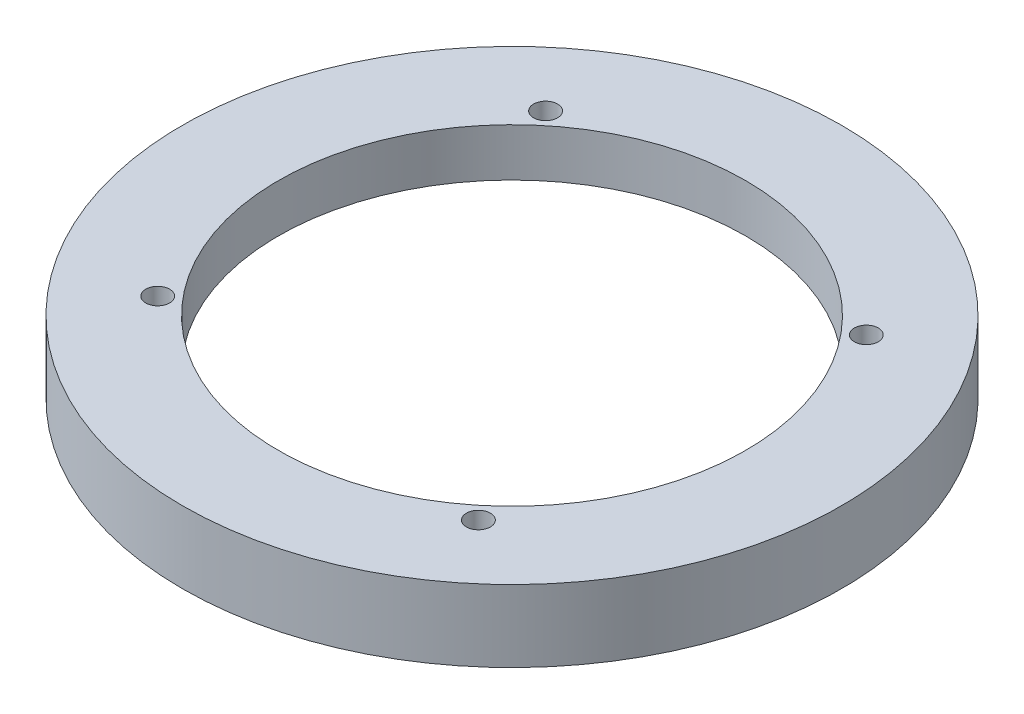
ISO-10303-21;
HEADER;
FILE_DESCRIPTION(('STEP AP214'),'2;1');
FILE_NAME('part.step','',(''),(''),'','','');
FILE_SCHEMA(('AUTOMOTIVE_DESIGN { 1 0 10303 214 1 1 1 1 }'));
ENDSEC;
DATA;
#1=APPLICATION_CONTEXT('core data for automotive mechanical design processes');
#2=APPLICATION_PROTOCOL_DEFINITION('international standard','automotive_design',2000,#1);
#3=PRODUCT_CONTEXT('',#1,'mechanical');
#4=PRODUCT('Part','Part','',(#3));
#5=PRODUCT_RELATED_PRODUCT_CATEGORY('part','',(#4));
#6=PRODUCT_DEFINITION_FORMATION('','',#4);
#7=PRODUCT_DEFINITION_CONTEXT('part definition',#1,'design');
#8=PRODUCT_DEFINITION('design','',#6,#7);
#9=PRODUCT_DEFINITION_SHAPE('','',#8);
#10=(LENGTH_UNIT() NAMED_UNIT(*) SI_UNIT(.MILLI.,.METRE.));
#11=(NAMED_UNIT(*) PLANE_ANGLE_UNIT() SI_UNIT($,.RADIAN.));
#12=(NAMED_UNIT(*) SI_UNIT($,.STERADIAN.) SOLID_ANGLE_UNIT());
#13=UNCERTAINTY_MEASURE_WITH_UNIT(LENGTH_MEASURE(1.E-05),#10,'distance_accuracy_value','');
#14=(GEOMETRIC_REPRESENTATION_CONTEXT(3) GLOBAL_UNCERTAINTY_ASSIGNED_CONTEXT((#13)) GLOBAL_UNIT_ASSIGNED_CONTEXT((#10,
#11,#12)) REPRESENTATION_CONTEXT('',''));
#15=CARTESIAN_POINT('',(0.,0.,0.));
#16=DIRECTION('',(0.,0.,1.));
#17=DIRECTION('',(1.,0.,0.));
#18=AXIS2_PLACEMENT_3D('',#15,#16,#17);
#19=CARTESIAN_POINT('',(0.,0.,0.));
#20=DIRECTION('',(0.,1.,0.));
#21=DIRECTION('',(0.,0.,1.));
#22=AXIS2_PLACEMENT_3D('',#19,#20,#21);
#23=PLANE('',#22);
#24=CARTESIAN_POINT('',(0.,0.,0.));
#25=DIRECTION('',(0.,1.,0.));
#26=DIRECTION('',(0.,0.,1.));
#27=AXIS2_PLACEMENT_3D('',#24,#25,#26);
#28=CIRCLE('',#27,137.5);
#29=CARTESIAN_POINT('',(0.,0.,137.5));
#30=VERTEX_POINT('',#29);
#31=EDGE_CURVE('E10',#30,#30,#28,.T.);
#32=ORIENTED_EDGE('',*,*,#31,.F.);
#33=EDGE_LOOP('',(#32));
#34=FACE_BOUND('',#33,.T.);
#35=CARTESIAN_POINT('',(0.,0.,0.));
#36=DIRECTION('',(0.,1.,0.));
#37=DIRECTION('',(0.,0.,1.));
#38=AXIS2_PLACEMENT_3D('',#35,#36,#37);
#39=CIRCLE('',#38,117.5);
#40=CARTESIAN_POINT('',(0.,0.,117.5));
#41=VERTEX_POINT('',#40);
#42=EDGE_CURVE('E45',#41,#41,#39,.T.);
#43=ORIENTED_EDGE('',*,*,#42,.T.);
#44=EDGE_LOOP('',(#43));
#45=FACE_BOUND('',#44,.T.);
#46=ADVANCED_FACE('F36',(#34,#45),#23,.F.);
#47=CARTESIAN_POINT('',(0.,10.,0.));
#48=DIRECTION('',(0.,-1.,0.));
#49=DIRECTION('',(0.,0.,-1.));
#50=AXIS2_PLACEMENT_3D('',#47,#48,#49);
#51=CYLINDRICAL_SURFACE('',#50,137.5);
#52=ORIENTED_EDGE('',*,*,#31,.T.);
#53=EDGE_LOOP('',(#52));
#54=FACE_BOUND('',#53,.T.);
#55=CARTESIAN_POINT('',(0.,30.,0.));
#56=DIRECTION('',(0.,1.,0.));
#57=DIRECTION('',(0.,0.,1.));
#58=AXIS2_PLACEMENT_3D('',#55,#56,#57);
#59=CIRCLE('',#58,137.5);
#60=CARTESIAN_POINT('',(0.,30.,137.5));
#61=VERTEX_POINT('',#60);
#62=EDGE_CURVE('E89',#61,#61,#59,.T.);
#63=ORIENTED_EDGE('',*,*,#62,.F.);
#64=EDGE_LOOP('',(#63));
#65=FACE_BOUND('',#64,.T.);
#66=ADVANCED_FACE('F38',(#54,#65),#51,.T.);
#67=CARTESIAN_POINT('',(0.,10.,0.));
#68=DIRECTION('',(0.,-1.,0.));
#69=DIRECTION('',(0.,0.,-1.));
#70=AXIS2_PLACEMENT_3D('',#67,#68,#69);
#71=CYLINDRICAL_SURFACE('',#70,117.5);
#72=CARTESIAN_POINT('',(0.,10.,0.));
#73=DIRECTION('',(0.,1.,0.));
#74=DIRECTION('',(0.,0.,1.));
#75=AXIS2_PLACEMENT_3D('',#72,#73,#74);
#76=CIRCLE('',#75,117.5);
#77=CARTESIAN_POINT('',(0.,10.,117.5));
#78=VERTEX_POINT('',#77);
#79=EDGE_CURVE('E51',#78,#78,#76,.T.);
#80=ORIENTED_EDGE('',*,*,#79,.T.);
#81=EDGE_LOOP('',(#80));
#82=FACE_BOUND('',#81,.T.);
#83=ORIENTED_EDGE('',*,*,#42,.F.);
#84=EDGE_LOOP('',(#83));
#85=FACE_BOUND('',#84,.T.);
#86=ADVANCED_FACE('F99',(#82,#85),#71,.F.);
#87=CARTESIAN_POINT('',(0.,10.,0.));
#88=DIRECTION('',(0.,1.,0.));
#89=DIRECTION('',(0.,0.,1.));
#90=AXIS2_PLACEMENT_3D('',#87,#88,#89);
#91=PLANE('',#90);
#92=CARTESIAN_POINT('',(80.9224468627568,10.,-66.9070817920863));
#93=DIRECTION('',(0.,1.,0.));
#94=DIRECTION('',(0.,0.,1.));
#95=AXIS2_PLACEMENT_3D('',#92,#93,#94);
#96=CIRCLE('',#95,5.00000000000001);
#97=CARTESIAN_POINT('',(80.9224468627568,10.,-61.9070817920863));
#98=VERTEX_POINT('',#97);
#99=EDGE_CURVE('E80',#98,#98,#96,.T.);
#100=ORIENTED_EDGE('',*,*,#99,.T.);
#101=EDGE_LOOP('',(#100));
#102=FACE_BOUND('',#101,.T.);
#103=CARTESIAN_POINT('',(66.9070817930606,10.,80.9224468615739));
#104=DIRECTION('',(0.,1.,0.));
#105=DIRECTION('',(0.,0.,1.));
#106=AXIS2_PLACEMENT_3D('',#103,#104,#105);
#107=CIRCLE('',#106,4.99999999999999);
#108=CARTESIAN_POINT('',(66.9070817930606,10.,85.9224468615739));
#109=VERTEX_POINT('',#108);
#110=EDGE_CURVE('E67',#109,#109,#107,.T.);
#111=ORIENTED_EDGE('',*,*,#110,.T.);
#112=EDGE_LOOP('',(#111));
#113=FACE_BOUND('',#112,.T.);
#114=CARTESIAN_POINT('',(-80.9224468605993,10.,66.9070817918775));
#115=DIRECTION('',(0.,1.,0.));
#116=DIRECTION('',(0.,0.,1.));
#117=AXIS2_PLACEMENT_3D('',#114,#115,#116);
#118=CIRCLE('',#117,5.00000000000001);
#119=CARTESIAN_POINT('',(-80.9224468605993,10.,71.9070817918775));
#120=VERTEX_POINT('',#119);
#121=EDGE_CURVE('E63',#120,#120,#118,.T.);
#122=ORIENTED_EDGE('',*,*,#121,.T.);
#123=EDGE_LOOP('',(#122));
#124=FACE_BOUND('',#123,.T.);
#125=CARTESIAN_POINT('',(-66.9070817909032,10.,-80.9224468617801));
#126=DIRECTION('',(0.,1.,0.));
#127=DIRECTION('',(0.,0.,1.));
#128=AXIS2_PLACEMENT_3D('',#125,#126,#127);
#129=CIRCLE('',#128,5.00000000000001);
#130=CARTESIAN_POINT('',(-66.9070817909032,10.,-75.9224468617801));
#131=VERTEX_POINT('',#130);
#132=EDGE_CURVE('E59',#131,#131,#129,.T.);
#133=ORIENTED_EDGE('',*,*,#132,.T.);
#134=EDGE_LOOP('',(#133));
#135=FACE_BOUND('',#134,.T.);
#136=CARTESIAN_POINT('',(0.,10.,0.));
#137=DIRECTION('',(0.,-1.,0.));
#138=DIRECTION('',(0.,0.,-1.));
#139=AXIS2_PLACEMENT_3D('',#136,#137,#138);
#140=CIRCLE('',#139,97.5);
#141=CARTESIAN_POINT('',(0.,10.,-97.5));
#142=VERTEX_POINT('',#141);
#143=EDGE_CURVE('E84',#142,#142,#140,.T.);
#144=ORIENTED_EDGE('',*,*,#143,.F.);
#145=EDGE_LOOP('',(#144));
#146=FACE_BOUND('',#145,.T.);
#147=ORIENTED_EDGE('',*,*,#79,.F.);
#148=EDGE_LOOP('',(#147));
#149=FACE_BOUND('',#148,.T.);
#150=ADVANCED_FACE('F102',(#102,#113,#124,#135,#146,#149),#91,.F.);
#151=CARTESIAN_POINT('',(0.,30.,0.));
#152=DIRECTION('',(0.,1.,0.));
#153=DIRECTION('',(0.,0.,1.));
#154=AXIS2_PLACEMENT_3D('',#151,#152,#153);
#155=PLANE('',#154);
#156=CARTESIAN_POINT('',(80.9224468627568,30.,-66.9070817920863));
#157=DIRECTION('',(0.,1.,0.));
#158=DIRECTION('',(0.,0.,1.));
#159=AXIS2_PLACEMENT_3D('',#156,#157,#158);
#160=CIRCLE('',#159,5.00000000000001);
#161=CARTESIAN_POINT('',(80.9224468627568,30.,-61.9070817920863));
#162=VERTEX_POINT('',#161);
#163=EDGE_CURVE('E40',#162,#162,#160,.T.);
#164=ORIENTED_EDGE('',*,*,#163,.F.);
#165=EDGE_LOOP('',(#164));
#166=FACE_BOUND('',#165,.T.);
#167=CARTESIAN_POINT('',(66.9070817930606,30.,80.9224468615739));
#168=DIRECTION('',(0.,1.,0.));
#169=DIRECTION('',(0.,0.,1.));
#170=AXIS2_PLACEMENT_3D('',#167,#168,#169);
#171=CIRCLE('',#170,4.99999999999999);
#172=CARTESIAN_POINT('',(66.9070817930606,30.,85.9224468615739));
#173=VERTEX_POINT('',#172);
#174=EDGE_CURVE('E64',#173,#173,#171,.T.);
#175=ORIENTED_EDGE('',*,*,#174,.F.);
#176=EDGE_LOOP('',(#175));
#177=FACE_BOUND('',#176,.T.);
#178=CARTESIAN_POINT('',(-80.9224468605993,30.,66.9070817918775));
#179=DIRECTION('',(0.,1.,0.));
#180=DIRECTION('',(0.,0.,1.));
#181=AXIS2_PLACEMENT_3D('',#178,#179,#180);
#182=CIRCLE('',#181,5.00000000000001);
#183=CARTESIAN_POINT('',(-80.9224468605993,30.,71.9070817918775));
#184=VERTEX_POINT('',#183);
#185=EDGE_CURVE('E60',#184,#184,#182,.T.);
#186=ORIENTED_EDGE('',*,*,#185,.F.);
#187=EDGE_LOOP('',(#186));
#188=FACE_BOUND('',#187,.T.);
#189=CARTESIAN_POINT('',(-66.9070817909032,30.,-80.9224468617801));
#190=DIRECTION('',(0.,1.,0.));
#191=DIRECTION('',(0.,0.,1.));
#192=AXIS2_PLACEMENT_3D('',#189,#190,#191);
#193=CIRCLE('',#192,5.00000000000001);
#194=CARTESIAN_POINT('',(-66.9070817909032,30.,-75.9224468617801));
#195=VERTEX_POINT('',#194);
#196=EDGE_CURVE('E55',#195,#195,#193,.T.);
#197=ORIENTED_EDGE('',*,*,#196,.F.);
#198=EDGE_LOOP('',(#197));
#199=FACE_BOUND('',#198,.T.);
#200=CARTESIAN_POINT('',(0.,30.,0.));
#201=DIRECTION('',(0.,-1.,0.));
#202=DIRECTION('',(0.,0.,-1.));
#203=AXIS2_PLACEMENT_3D('',#200,#201,#202);
#204=CIRCLE('',#203,97.5);
#205=CARTESIAN_POINT('',(0.,30.,-97.5));
#206=VERTEX_POINT('',#205);
#207=EDGE_CURVE('E85',#206,#206,#204,.T.);
#208=ORIENTED_EDGE('',*,*,#207,.T.);
#209=EDGE_LOOP('',(#208));
#210=FACE_BOUND('',#209,.T.);
#211=ORIENTED_EDGE('',*,*,#62,.T.);
#212=EDGE_LOOP('',(#211));
#213=FACE_BOUND('',#212,.T.);
#214=ADVANCED_FACE('F104',(#166,#177,#188,#199,#210,#213),#155,.T.);
#215=CARTESIAN_POINT('',(0.,30.,0.));
#216=DIRECTION('',(0.,-1.,0.));
#217=DIRECTION('',(0.,0.,-1.));
#218=AXIS2_PLACEMENT_3D('',#215,#216,#217);
#219=CYLINDRICAL_SURFACE('',#218,97.5);
#220=ORIENTED_EDGE('',*,*,#207,.F.);
#221=EDGE_LOOP('',(#220));
#222=FACE_BOUND('',#221,.T.);
#223=ORIENTED_EDGE('',*,*,#143,.T.);
#224=EDGE_LOOP('',(#223));
#225=FACE_BOUND('',#224,.T.);
#226=ADVANCED_FACE('F111',(#222,#225),#219,.F.);
#227=CARTESIAN_POINT('',(-66.9070817909032,0.,-80.9224468617801));
#228=DIRECTION('',(0.,1.,0.));
#229=DIRECTION('',(0.,0.,1.));
#230=AXIS2_PLACEMENT_3D('',#227,#228,#229);
#231=CYLINDRICAL_SURFACE('',#230,5.00000000000001);
#232=ORIENTED_EDGE('',*,*,#196,.T.);
#233=EDGE_LOOP('',(#232));
#234=FACE_BOUND('',#233,.T.);
#235=ORIENTED_EDGE('',*,*,#132,.F.);
#236=EDGE_LOOP('',(#235));
#237=FACE_BOUND('',#236,.T.);
#238=ADVANCED_FACE('F150',(#234,#237),#231,.F.);
#239=CARTESIAN_POINT('',(-80.9224468605993,0.,66.9070817918775));
#240=DIRECTION('',(0.,1.,0.));
#241=DIRECTION('',(0.,0.,1.));
#242=AXIS2_PLACEMENT_3D('',#239,#240,#241);
#243=CYLINDRICAL_SURFACE('',#242,5.00000000000001);
#244=ORIENTED_EDGE('',*,*,#185,.T.);
#245=EDGE_LOOP('',(#244));
#246=FACE_BOUND('',#245,.T.);
#247=ORIENTED_EDGE('',*,*,#121,.F.);
#248=EDGE_LOOP('',(#247));
#249=FACE_BOUND('',#248,.T.);
#250=ADVANCED_FACE('F156',(#246,#249),#243,.F.);
#251=CARTESIAN_POINT('',(66.9070817930606,0.,80.9224468615739));
#252=DIRECTION('',(0.,1.,0.));
#253=DIRECTION('',(0.,0.,1.));
#254=AXIS2_PLACEMENT_3D('',#251,#252,#253);
#255=CYLINDRICAL_SURFACE('',#254,4.99999999999999);
#256=ORIENTED_EDGE('',*,*,#174,.T.);
#257=EDGE_LOOP('',(#256));
#258=FACE_BOUND('',#257,.T.);
#259=ORIENTED_EDGE('',*,*,#110,.F.);
#260=EDGE_LOOP('',(#259));
#261=FACE_BOUND('',#260,.T.);
#262=ADVANCED_FACE('F164',(#258,#261),#255,.F.);
#263=CARTESIAN_POINT('',(80.9224468627568,0.,-66.9070817920863));
#264=DIRECTION('',(0.,1.,0.));
#265=DIRECTION('',(0.,0.,1.));
#266=AXIS2_PLACEMENT_3D('',#263,#264,#265);
#267=CYLINDRICAL_SURFACE('',#266,5.00000000000001);
#268=ORIENTED_EDGE('',*,*,#163,.T.);
#269=EDGE_LOOP('',(#268));
#270=FACE_BOUND('',#269,.T.);
#271=ORIENTED_EDGE('',*,*,#99,.F.);
#272=EDGE_LOOP('',(#271));
#273=FACE_BOUND('',#272,.T.);
#274=ADVANCED_FACE('F172',(#270,#273),#267,.F.);
#275=CLOSED_SHELL('',(#46,#66,#86,#150,#214,#226,#238,#250,#262,#274));
#276=MANIFOLD_SOLID_BREP('B2',#275);
#277=ADVANCED_BREP_SHAPE_REPRESENTATION('',(#18,#276),#14);
#278=SHAPE_DEFINITION_REPRESENTATION(#9,#277);
ENDSEC;
END-ISO-10303-21;
